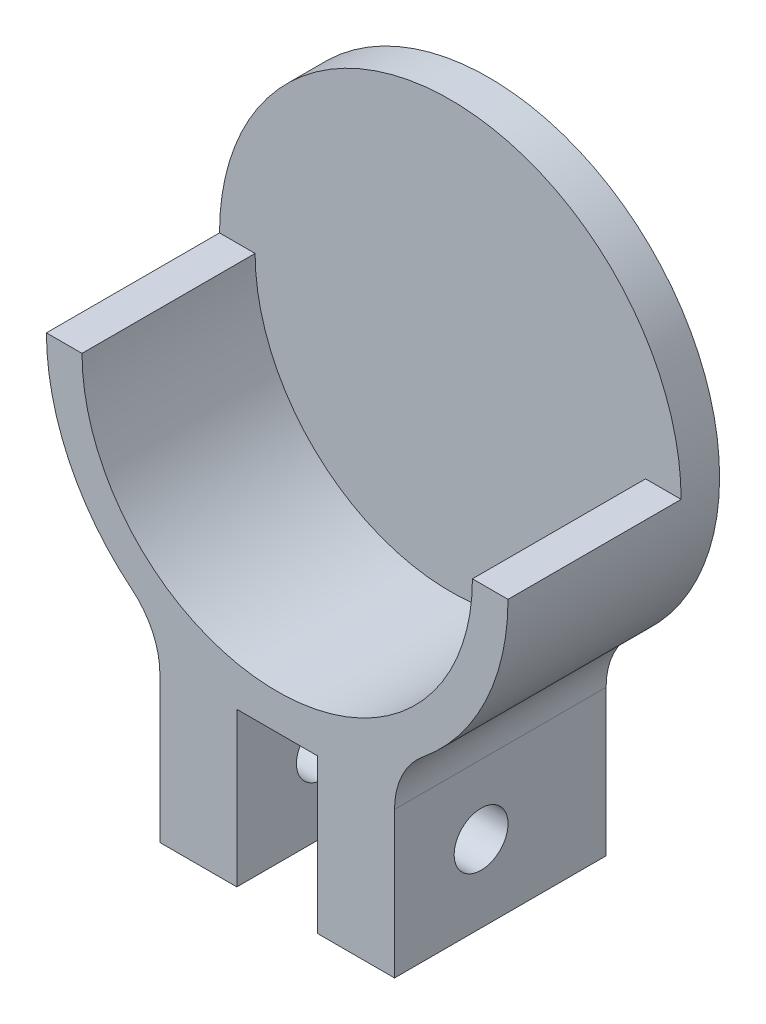
ISO-10303-21;
HEADER;
FILE_DESCRIPTION(('STEP AP214'),'2;1');
FILE_NAME('part.step','',(''),(''),'','','');
FILE_SCHEMA(('AUTOMOTIVE_DESIGN { 1 0 10303 214 1 1 1 1 }'));
ENDSEC;
DATA;
#1=APPLICATION_CONTEXT('core data for automotive mechanical design processes');
#2=APPLICATION_PROTOCOL_DEFINITION('international standard','automotive_design',2000,#1);
#3=PRODUCT_CONTEXT('',#1,'mechanical');
#4=PRODUCT('Part','Part','',(#3));
#5=PRODUCT_RELATED_PRODUCT_CATEGORY('part','',(#4));
#6=PRODUCT_DEFINITION_FORMATION('','',#4);
#7=PRODUCT_DEFINITION_CONTEXT('part definition',#1,'design');
#8=PRODUCT_DEFINITION('design','',#6,#7);
#9=PRODUCT_DEFINITION_SHAPE('','',#8);
#10=(LENGTH_UNIT() NAMED_UNIT(*) SI_UNIT(.MILLI.,.METRE.));
#11=(NAMED_UNIT(*) PLANE_ANGLE_UNIT() SI_UNIT($,.RADIAN.));
#12=(NAMED_UNIT(*) SI_UNIT($,.STERADIAN.) SOLID_ANGLE_UNIT());
#13=UNCERTAINTY_MEASURE_WITH_UNIT(LENGTH_MEASURE(1.E-05),#10,'distance_accuracy_value','');
#14=(GEOMETRIC_REPRESENTATION_CONTEXT(3) GLOBAL_UNCERTAINTY_ASSIGNED_CONTEXT((#13)) GLOBAL_UNIT_ASSIGNED_CONTEXT((#10,
#11,#12)) REPRESENTATION_CONTEXT('',''));
#15=CARTESIAN_POINT('',(0.,0.,0.));
#16=DIRECTION('',(0.,0.,1.));
#17=DIRECTION('',(1.,0.,0.));
#18=AXIS2_PLACEMENT_3D('',#15,#16,#17);
#19=CARTESIAN_POINT('',(-2.09999999991755,-12.,9.));
#20=DIRECTION('',(0.,1.,0.));
#21=DIRECTION('',(0.,0.,1.));
#22=AXIS2_PLACEMENT_3D('',#19,#20,#21);
#23=PLANE('',#22);
#24=DIRECTION('',(0.,0.,-1.));
#25=VECTOR('',#24,1.);
#26=CARTESIAN_POINT('',(-2.09999999991755,-12.,9.));
#27=LINE('',#26,#25);
#28=CARTESIAN_POINT('',(-2.09999999991755,-12.,9.));
#29=VERTEX_POINT('',#28);
#30=CARTESIAN_POINT('',(-2.09999999991755,-12.,-2.));
#31=VERTEX_POINT('',#30);
#32=EDGE_CURVE('E225',#29,#31,#27,.T.);
#33=ORIENTED_EDGE('',*,*,#32,.T.);
#34=DIRECTION('',(-1.,0.,0.));
#35=VECTOR('',#34,1.);
#36=CARTESIAN_POINT('',(0.,-12.,-2.));
#37=LINE('',#36,#35);
#38=CARTESIAN_POINT('',(2.09999999991755,-12.,-2.));
#39=VERTEX_POINT('',#38);
#40=EDGE_CURVE('E176',#39,#31,#37,.T.);
#41=ORIENTED_EDGE('',*,*,#40,.F.);
#42=DIRECTION('',(0.,0.,-1.));
#43=VECTOR('',#42,1.);
#44=CARTESIAN_POINT('',(2.09999999991755,-12.,9.));
#45=LINE('',#44,#43);
#46=CARTESIAN_POINT('',(2.09999999991755,-12.,9.));
#47=VERTEX_POINT('',#46);
#48=EDGE_CURVE('E149',#47,#39,#45,.T.);
#49=ORIENTED_EDGE('',*,*,#48,.F.);
#50=DIRECTION('',(1.,0.,0.));
#51=VECTOR('',#50,1.);
#52=CARTESIAN_POINT('',(-2.09999999991755,-12.,9.));
#53=LINE('',#52,#51);
#54=EDGE_CURVE('E199',#29,#47,#53,.T.);
#55=ORIENTED_EDGE('',*,*,#54,.F.);
#56=EDGE_LOOP('',(#33,#41,#49,#55));
#57=FACE_BOUND('',#56,.T.);
#58=ADVANCED_FACE('F39',(#57),#23,.F.);
#59=CARTESIAN_POINT('',(2.09999999991755,-20.,9.));
#60=DIRECTION('',(1.,0.,0.));
#61=DIRECTION('',(0.,0.,-1.));
#62=AXIS2_PLACEMENT_3D('',#59,#60,#61);
#63=PLANE('',#62);
#64=CARTESIAN_POINT('',(2.09999999991755,-15.9999999999286,4.5));
#65=DIRECTION('',(1.,0.,0.));
#66=DIRECTION('',(0.,0.,-1.));
#67=AXIS2_PLACEMENT_3D('',#64,#65,#66);
#68=CIRCLE('',#67,1.4);
#69=CARTESIAN_POINT('',(2.09999999991755,-15.9999999999286,3.1));
#70=VERTEX_POINT('',#69);
#71=EDGE_CURVE('E195',#70,#70,#68,.T.);
#72=ORIENTED_EDGE('',*,*,#71,.T.);
#73=EDGE_LOOP('',(#72));
#74=FACE_BOUND('',#73,.T.);
#75=ORIENTED_EDGE('',*,*,#48,.T.);
#76=DIRECTION('',(0.,1.,0.));
#77=VECTOR('',#76,1.);
#78=CARTESIAN_POINT('',(2.09999999991755,0.,-2.));
#79=LINE('',#78,#77);
#80=CARTESIAN_POINT('',(2.09999999991755,-20.,-2.));
#81=VERTEX_POINT('',#80);
#82=EDGE_CURVE('E173',#81,#39,#79,.T.);
#83=ORIENTED_EDGE('',*,*,#82,.F.);
#84=DIRECTION('',(0.,0.,-1.));
#85=VECTOR('',#84,1.);
#86=CARTESIAN_POINT('',(2.09999999991755,-20.,9.));
#87=LINE('',#86,#85);
#88=CARTESIAN_POINT('',(2.09999999991755,-20.,9.));
#89=VERTEX_POINT('',#88);
#90=EDGE_CURVE('E251',#89,#81,#87,.T.);
#91=ORIENTED_EDGE('',*,*,#90,.F.);
#92=DIRECTION('',(0.,-1.,0.));
#93=VECTOR('',#92,1.);
#94=CARTESIAN_POINT('',(2.09999999991755,-20.,9.));
#95=LINE('',#94,#93);
#96=EDGE_CURVE('E202',#47,#89,#95,.T.);
#97=ORIENTED_EDGE('',*,*,#96,.F.);
#98=EDGE_LOOP('',(#75,#83,#91,#97));
#99=FACE_BOUND('',#98,.T.);
#100=ADVANCED_FACE('F271',(#74,#99),#63,.F.);
#101=CARTESIAN_POINT('',(6.09999999991755,-20.,9.));
#102=DIRECTION('',(0.,1.,0.));
#103=DIRECTION('',(-1.,0.,0.));
#104=AXIS2_PLACEMENT_3D('',#101,#102,#103);
#105=PLANE('',#104);
#106=ORIENTED_EDGE('',*,*,#90,.T.);
#107=DIRECTION('',(-1.,0.,0.));
#108=VECTOR('',#107,1.);
#109=CARTESIAN_POINT('',(0.,-20.,-2.));
#110=LINE('',#109,#108);
#111=CARTESIAN_POINT('',(6.09999999991755,-20.,-2.));
#112=VERTEX_POINT('',#111);
#113=EDGE_CURVE('E170',#112,#81,#110,.T.);
#114=ORIENTED_EDGE('',*,*,#113,.F.);
#115=DIRECTION('',(0.,0.,-1.));
#116=VECTOR('',#115,1.);
#117=CARTESIAN_POINT('',(6.09999999991755,-20.,9.));
#118=LINE('',#117,#116);
#119=CARTESIAN_POINT('',(6.09999999991755,-20.,9.));
#120=VERTEX_POINT('',#119);
#121=EDGE_CURVE('E249',#120,#112,#118,.T.);
#122=ORIENTED_EDGE('',*,*,#121,.F.);
#123=DIRECTION('',(1.,0.,0.));
#124=VECTOR('',#123,1.);
#125=CARTESIAN_POINT('',(6.09999999991755,-20.,9.));
#126=LINE('',#125,#124);
#127=EDGE_CURVE('E205',#89,#120,#126,.T.);
#128=ORIENTED_EDGE('',*,*,#127,.F.);
#129=EDGE_LOOP('',(#106,#114,#122,#128));
#130=FACE_BOUND('',#129,.T.);
#131=ADVANCED_FACE('F268',(#130),#105,.F.);
#132=CARTESIAN_POINT('',(6.09999999991755,-20.,9.));
#133=DIRECTION('',(-1.,8.53742552152238E-12,0.));
#134=DIRECTION('',(-8.53742552152238E-12,-1.,0.));
#135=AXIS2_PLACEMENT_3D('',#132,#133,#134);
#136=PLANE('',#135);
#137=CARTESIAN_POINT('',(6.0999999999517,-15.9999999998937,4.5));
#138=DIRECTION('',(-1.,8.53742552152238E-12,0.));
#139=DIRECTION('',(-8.53742552152238E-12,-1.,0.));
#140=AXIS2_PLACEMENT_3D('',#137,#138,#139);
#141=CIRCLE('',#140,1.4);
#142=CARTESIAN_POINT('',(6.09999999993975,-17.3999999998937,4.5));
#143=VERTEX_POINT('',#142);
#144=EDGE_CURVE('E192',#143,#143,#141,.T.);
#145=ORIENTED_EDGE('',*,*,#144,.T.);
#146=EDGE_LOOP('',(#145));
#147=FACE_BOUND('',#146,.T.);
#148=ORIENTED_EDGE('',*,*,#121,.T.);
#149=DIRECTION('',(-8.53742552152238E-12,-1.,0.));
#150=VECTOR('',#149,1.);
#151=CARTESIAN_POINT('',(6.1000000000883,-5.20782956820403E-11,-2.));
#152=LINE('',#151,#150);
#153=CARTESIAN_POINT('',(6.09999999998235,-12.4092707279481,-2.));
#154=VERTEX_POINT('',#153);
#155=EDGE_CURVE('E157',#154,#112,#152,.T.);
#156=ORIENTED_EDGE('',*,*,#155,.F.);
#157=DIRECTION('',(0.,0.,1.));
#158=VECTOR('',#157,1.);
#159=CARTESIAN_POINT('',(6.09999999998235,-12.4092707279481,9.));
#160=LINE('',#159,#158);
#161=CARTESIAN_POINT('',(6.09999999998235,-12.4092707279481,9.));
#162=VERTEX_POINT('',#161);
#163=EDGE_CURVE('E148',#154,#162,#160,.T.);
#164=ORIENTED_EDGE('',*,*,#163,.T.);
#165=DIRECTION('',(8.53742552152238E-12,1.,0.));
#166=VECTOR('',#165,1.);
#167=CARTESIAN_POINT('',(6.09999999991755,-20.,9.));
#168=LINE('',#167,#166);
#169=EDGE_CURVE('E207',#120,#162,#168,.T.);
#170=ORIENTED_EDGE('',*,*,#169,.F.);
#171=EDGE_LOOP('',(#148,#156,#164,#170));
#172=FACE_BOUND('',#171,.T.);
#173=ADVANCED_FACE('F264',(#147,#172),#136,.F.);
#174=CARTESIAN_POINT('',(10.1500000000034,0.,9.));
#175=DIRECTION('',(0.,-1.,0.));
#176=DIRECTION('',(0.,0.,-1.));
#177=AXIS2_PLACEMENT_3D('',#174,#175,#176);
#178=PLANE('',#177);
#179=DIRECTION('',(-1.,0.,0.));
#180=VECTOR('',#179,1.);
#181=CARTESIAN_POINT('',(10.1500000000034,0.,0.));
#182=LINE('',#181,#180);
#183=CARTESIAN_POINT('',(12.,0.,0.));
#184=VERTEX_POINT('',#183);
#185=CARTESIAN_POINT('',(10.1500000000017,0.,0.));
#186=VERTEX_POINT('',#185);
#187=EDGE_CURVE('E198',#184,#186,#182,.T.);
#188=ORIENTED_EDGE('',*,*,#187,.T.);
#189=DIRECTION('',(0.,0.,-1.));
#190=VECTOR('',#189,1.);
#191=CARTESIAN_POINT('',(10.1500000000017,0.,9.));
#192=LINE('',#191,#190);
#193=CARTESIAN_POINT('',(10.1500000000017,0.,9.));
#194=VERTEX_POINT('',#193);
#195=EDGE_CURVE('E243',#194,#186,#192,.T.);
#196=ORIENTED_EDGE('',*,*,#195,.F.);
#197=DIRECTION('',(-1.,0.,0.));
#198=VECTOR('',#197,1.);
#199=CARTESIAN_POINT('',(10.1500000000034,0.,9.));
#200=LINE('',#199,#198);
#201=CARTESIAN_POINT('',(12.,0.,9.));
#202=VERTEX_POINT('',#201);
#203=EDGE_CURVE('E211',#202,#194,#200,.T.);
#204=ORIENTED_EDGE('',*,*,#203,.F.);
#205=DIRECTION('',(0.,0.,-1.));
#206=VECTOR('',#205,1.);
#207=CARTESIAN_POINT('',(12.,0.,9.));
#208=LINE('',#207,#206);
#209=EDGE_CURVE('E246',#202,#184,#208,.T.);
#210=ORIENTED_EDGE('',*,*,#209,.T.);
#211=EDGE_LOOP('',(#188,#196,#204,#210));
#212=FACE_BOUND('',#211,.T.);
#213=ADVANCED_FACE('F313',(#212),#178,.F.);
#214=CARTESIAN_POINT('',(0.,0.,9.));
#215=DIRECTION('',(0.,0.,-1.));
#216=DIRECTION('',(-1.,0.,0.));
#217=AXIS2_PLACEMENT_3D('',#214,#215,#216);
#218=CYLINDRICAL_SURFACE('',#217,10.1500000000017);
#219=CARTESIAN_POINT('',(0.,0.,0.));
#220=DIRECTION('',(0.,0.,-1.));
#221=DIRECTION('',(1.,0.,0.));
#222=AXIS2_PLACEMENT_3D('',#219,#220,#221);
#223=CIRCLE('',#222,10.1500000000017);
#224=CARTESIAN_POINT('',(-10.15,0.,0.));
#225=VERTEX_POINT('',#224);
#226=EDGE_CURVE('E228',#186,#225,#223,.T.);
#227=ORIENTED_EDGE('',*,*,#226,.T.);
#228=DIRECTION('',(0.,0.,-1.));
#229=VECTOR('',#228,1.);
#230=CARTESIAN_POINT('',(-10.15,0.,9.));
#231=LINE('',#230,#229);
#232=CARTESIAN_POINT('',(-10.15,0.,9.));
#233=VERTEX_POINT('',#232);
#234=EDGE_CURVE('E240',#233,#225,#231,.T.);
#235=ORIENTED_EDGE('',*,*,#234,.F.);
#236=CARTESIAN_POINT('',(0.,0.,9.));
#237=DIRECTION('',(0.,0.,-1.));
#238=DIRECTION('',(1.,0.,0.));
#239=AXIS2_PLACEMENT_3D('',#236,#237,#238);
#240=CIRCLE('',#239,10.1500000000017);
#241=EDGE_CURVE('E213',#194,#233,#240,.T.);
#242=ORIENTED_EDGE('',*,*,#241,.F.);
#243=ORIENTED_EDGE('',*,*,#195,.T.);
#244=EDGE_LOOP('',(#227,#235,#242,#243));
#245=FACE_BOUND('',#244,.T.);
#246=ADVANCED_FACE('F317',(#245),#218,.F.);
#247=CARTESIAN_POINT('',(-12.,0.,9.));
#248=DIRECTION('',(0.,-1.,0.));
#249=DIRECTION('',(0.,0.,-1.));
#250=AXIS2_PLACEMENT_3D('',#247,#248,#249);
#251=PLANE('',#250);
#252=DIRECTION('',(-1.,0.,0.));
#253=VECTOR('',#252,1.);
#254=CARTESIAN_POINT('',(-12.,0.,0.));
#255=LINE('',#254,#253);
#256=CARTESIAN_POINT('',(-12.,0.,0.));
#257=VERTEX_POINT('',#256);
#258=EDGE_CURVE('E203',#225,#257,#255,.T.);
#259=ORIENTED_EDGE('',*,*,#258,.T.);
#260=DIRECTION('',(0.,0.,-1.));
#261=VECTOR('',#260,1.);
#262=CARTESIAN_POINT('',(-12.,0.,9.));
#263=LINE('',#262,#261);
#264=CARTESIAN_POINT('',(-12.,0.,9.));
#265=VERTEX_POINT('',#264);
#266=EDGE_CURVE('E238',#265,#257,#263,.T.);
#267=ORIENTED_EDGE('',*,*,#266,.F.);
#268=DIRECTION('',(-1.,0.,0.));
#269=VECTOR('',#268,1.);
#270=CARTESIAN_POINT('',(-12.,0.,9.));
#271=LINE('',#270,#269);
#272=EDGE_CURVE('E215',#233,#265,#271,.T.);
#273=ORIENTED_EDGE('',*,*,#272,.F.);
#274=ORIENTED_EDGE('',*,*,#234,.T.);
#275=EDGE_LOOP('',(#259,#267,#273,#274));
#276=FACE_BOUND('',#275,.T.);
#277=ADVANCED_FACE('F321',(#276),#251,.F.);
#278=CARTESIAN_POINT('',(0.,0.,9.));
#279=DIRECTION('',(0.,0.,-1.));
#280=DIRECTION('',(-1.,0.,0.));
#281=AXIS2_PLACEMENT_3D('',#278,#279,#280);
#282=CYLINDRICAL_SURFACE('',#281,12.);
#283=ORIENTED_EDGE('',*,*,#266,.T.);
#284=CARTESIAN_POINT('',(0.,0.,0.));
#285=DIRECTION('',(0.,0.,-1.));
#286=DIRECTION('',(-1.,0.,0.));
#287=AXIS2_PLACEMENT_3D('',#284,#285,#286);
#288=CIRCLE('',#287,12.);
#289=EDGE_CURVE('E164',#257,#184,#288,.T.);
#290=ORIENTED_EDGE('',*,*,#289,.T.);
#291=ORIENTED_EDGE('',*,*,#209,.F.);
#292=CARTESIAN_POINT('',(0.,0.,9.));
#293=DIRECTION('',(0.,0.,1.));
#294=DIRECTION('',(1.,0.,0.));
#295=AXIS2_PLACEMENT_3D('',#292,#293,#294);
#296=CIRCLE('',#295,12.);
#297=CARTESIAN_POINT('',(7.57499999998677,-9.30695304598669,9.));
#298=VERTEX_POINT('',#297);
#299=EDGE_CURVE('E145',#298,#202,#296,.T.);
#300=ORIENTED_EDGE('',*,*,#299,.F.);
#301=DIRECTION('',(0.,0.,-1.));
#302=VECTOR('',#301,1.);
#303=CARTESIAN_POINT('',(7.57499999998677,-9.30695304598669,9.));
#304=LINE('',#303,#302);
#305=CARTESIAN_POINT('',(7.57499999998677,-9.30695304598669,-2.));
#306=VERTEX_POINT('',#305);
#307=EDGE_CURVE('E138',#298,#306,#304,.T.);
#308=ORIENTED_EDGE('',*,*,#307,.T.);
#309=CARTESIAN_POINT('',(0.,0.,-2.));
#310=DIRECTION('',(0.,0.,-1.));
#311=DIRECTION('',(-1.,0.,0.));
#312=AXIS2_PLACEMENT_3D('',#309,#310,#311);
#313=CIRCLE('',#312,12.);
#314=CARTESIAN_POINT('',(-7.57499999998673,-9.3069530459867,-2.));
#315=VERTEX_POINT('',#314);
#316=EDGE_CURVE('E143',#315,#306,#313,.T.);
#317=ORIENTED_EDGE('',*,*,#316,.F.);
#318=DIRECTION('',(0.,0.,-1.));
#319=VECTOR('',#318,1.);
#320=CARTESIAN_POINT('',(-7.57499999998672,-9.30695304598671,9.));
#321=LINE('',#320,#319);
#322=CARTESIAN_POINT('',(-7.57499999998673,-9.30695304598671,9.));
#323=VERTEX_POINT('',#322);
#324=EDGE_CURVE('E54',#315,#323,#321,.F.);
#325=ORIENTED_EDGE('',*,*,#324,.T.);
#326=CARTESIAN_POINT('',(0.,0.,9.));
#327=DIRECTION('',(0.,0.,1.));
#328=DIRECTION('',(1.,0.,0.));
#329=AXIS2_PLACEMENT_3D('',#326,#327,#328);
#330=CIRCLE('',#329,12.);
#331=EDGE_CURVE('E217',#265,#323,#330,.T.);
#332=ORIENTED_EDGE('',*,*,#331,.F.);
#333=EDGE_LOOP('',(#283,#290,#291,#300,#308,#317,#325,#332));
#334=FACE_BOUND('',#333,.T.);
#335=ADVANCED_FACE('F141',(#334),#282,.T.);
#336=CARTESIAN_POINT('',(-6.09999999991755,-20.,9.));
#337=DIRECTION('',(1.,8.53006745111504E-12,0.));
#338=DIRECTION('',(-8.53006745111504E-12,1.,0.));
#339=AXIS2_PLACEMENT_3D('',#336,#337,#338);
#340=PLANE('',#339);
#341=CARTESIAN_POINT('',(-6.09999999994878,-16.,4.5));
#342=DIRECTION('',(-1.,-8.71029140230134E-12,0.));
#343=DIRECTION('',(8.71029140230134E-12,-1.,0.));
#344=AXIS2_PLACEMENT_3D('',#341,#342,#343);
#345=CIRCLE('',#344,1.4);
#346=CARTESIAN_POINT('',(-6.09999999993659,-17.4,4.5));
#347=VERTEX_POINT('',#346);
#348=EDGE_CURVE('E187',#347,#347,#345,.T.);
#349=ORIENTED_EDGE('',*,*,#348,.F.);
#350=EDGE_LOOP('',(#349));
#351=FACE_BOUND('',#350,.T.);
#352=DIRECTION('',(8.53006745111504E-12,-1.,0.));
#353=VECTOR('',#352,1.);
#354=CARTESIAN_POINT('',(-6.09999999991755,-20.,9.));
#355=LINE('',#354,#353);
#356=CARTESIAN_POINT('',(-6.0999999999823,-12.4092707279482,9.));
#357=VERTEX_POINT('',#356);
#358=CARTESIAN_POINT('',(-6.09999999991755,-20.,9.));
#359=VERTEX_POINT('',#358);
#360=EDGE_CURVE('E219',#357,#359,#355,.T.);
#361=ORIENTED_EDGE('',*,*,#360,.F.);
#362=DIRECTION('',(0.,0.,1.));
#363=VECTOR('',#362,1.);
#364=CARTESIAN_POINT('',(-6.0999999999823,-12.4092707279482,0.));
#365=LINE('',#364,#363);
#366=CARTESIAN_POINT('',(-6.0999999999823,-12.4092707279482,-2.));
#367=VERTEX_POINT('',#366);
#368=EDGE_CURVE('E257',#357,#367,#365,.F.);
#369=ORIENTED_EDGE('',*,*,#368,.T.);
#370=DIRECTION('',(-8.53006745111504E-12,1.,0.));
#371=VECTOR('',#370,1.);
#372=CARTESIAN_POINT('',(-6.10000000008815,-5.20334114525537E-11,-2.));
#373=LINE('',#372,#371);
#374=CARTESIAN_POINT('',(-6.09999999991755,-20.,-2.));
#375=VERTEX_POINT('',#374);
#376=EDGE_CURVE('E185',#375,#367,#373,.T.);
#377=ORIENTED_EDGE('',*,*,#376,.F.);
#378=DIRECTION('',(0.,0.,-1.));
#379=VECTOR('',#378,1.);
#380=CARTESIAN_POINT('',(-6.09999999991755,-20.,9.));
#381=LINE('',#380,#379);
#382=EDGE_CURVE('E236',#359,#375,#381,.T.);
#383=ORIENTED_EDGE('',*,*,#382,.F.);
#384=EDGE_LOOP('',(#361,#369,#377,#383));
#385=FACE_BOUND('',#384,.T.);
#386=ADVANCED_FACE('F289',(#351,#385),#340,.F.);
#387=CARTESIAN_POINT('',(-6.09999999991755,-20.,9.));
#388=DIRECTION('',(0.,1.,0.));
#389=DIRECTION('',(-1.,0.,0.));
#390=AXIS2_PLACEMENT_3D('',#387,#388,#389);
#391=PLANE('',#390);
#392=ORIENTED_EDGE('',*,*,#382,.T.);
#393=DIRECTION('',(-1.,0.,0.));
#394=VECTOR('',#393,1.);
#395=CARTESIAN_POINT('',(0.,-20.,-2.));
#396=LINE('',#395,#394);
#397=CARTESIAN_POINT('',(-2.09999999991755,-20.,-2.));
#398=VERTEX_POINT('',#397);
#399=EDGE_CURVE('E182',#398,#375,#396,.T.);
#400=ORIENTED_EDGE('',*,*,#399,.F.);
#401=DIRECTION('',(0.,0.,-1.));
#402=VECTOR('',#401,1.);
#403=CARTESIAN_POINT('',(-2.09999999991755,-20.,9.));
#404=LINE('',#403,#402);
#405=CARTESIAN_POINT('',(-2.09999999991755,-20.,9.));
#406=VERTEX_POINT('',#405);
#407=EDGE_CURVE('E234',#406,#398,#404,.T.);
#408=ORIENTED_EDGE('',*,*,#407,.F.);
#409=DIRECTION('',(1.,0.,0.));
#410=VECTOR('',#409,1.);
#411=CARTESIAN_POINT('',(-6.09999999991755,-20.,9.));
#412=LINE('',#411,#410);
#413=EDGE_CURVE('E221',#359,#406,#412,.T.);
#414=ORIENTED_EDGE('',*,*,#413,.F.);
#415=EDGE_LOOP('',(#392,#400,#408,#414));
#416=FACE_BOUND('',#415,.T.);
#417=ADVANCED_FACE('F285',(#416),#391,.F.);
#418=CARTESIAN_POINT('',(-2.09999999991755,-20.,9.));
#419=DIRECTION('',(-1.,0.,0.));
#420=DIRECTION('',(0.,0.,1.));
#421=AXIS2_PLACEMENT_3D('',#418,#419,#420);
#422=PLANE('',#421);
#423=CARTESIAN_POINT('',(-2.09999999991755,-15.9999999999652,4.5));
#424=DIRECTION('',(-1.,0.,0.));
#425=DIRECTION('',(0.,0.,1.));
#426=AXIS2_PLACEMENT_3D('',#423,#424,#425);
#427=CIRCLE('',#426,1.4);
#428=CARTESIAN_POINT('',(-2.09999999991755,-15.9999999999652,5.9));
#429=VERTEX_POINT('',#428);
#430=EDGE_CURVE('E191',#429,#429,#427,.T.);
#431=ORIENTED_EDGE('',*,*,#430,.T.);
#432=EDGE_LOOP('',(#431));
#433=FACE_BOUND('',#432,.T.);
#434=ORIENTED_EDGE('',*,*,#407,.T.);
#435=DIRECTION('',(0.,-1.,0.));
#436=VECTOR('',#435,1.);
#437=CARTESIAN_POINT('',(-2.09999999991755,0.,-2.));
#438=LINE('',#437,#436);
#439=EDGE_CURVE('E179',#31,#398,#438,.T.);
#440=ORIENTED_EDGE('',*,*,#439,.F.);
#441=ORIENTED_EDGE('',*,*,#32,.F.);
#442=DIRECTION('',(0.,1.,0.));
#443=VECTOR('',#442,1.);
#444=CARTESIAN_POINT('',(-2.09999999991755,-20.,9.));
#445=LINE('',#444,#443);
#446=EDGE_CURVE('E223',#406,#29,#445,.T.);
#447=ORIENTED_EDGE('',*,*,#446,.F.);
#448=EDGE_LOOP('',(#434,#440,#441,#447));
#449=FACE_BOUND('',#448,.T.);
#450=ADVANCED_FACE('F280',(#433,#449),#422,.F.);
#451=CARTESIAN_POINT('',(0.,0.,9.));
#452=DIRECTION('',(0.,0.,1.));
#453=DIRECTION('',(1.,0.,0.));
#454=AXIS2_PLACEMENT_3D('',#451,#452,#453);
#455=PLANE('',#454);
#456=ORIENTED_EDGE('',*,*,#54,.T.);
#457=ORIENTED_EDGE('',*,*,#96,.T.);
#458=ORIENTED_EDGE('',*,*,#127,.T.);
#459=ORIENTED_EDGE('',*,*,#169,.T.);
#460=CARTESIAN_POINT('',(10.0999999999824,-12.4092707279823,9.));
#461=DIRECTION('',(0.,0.,1.));
#462=DIRECTION('',(1.,0.,0.));
#463=AXIS2_PLACEMENT_3D('',#460,#461,#462);
#464=CIRCLE('',#463,4.);
#465=EDGE_CURVE('E47',#162,#298,#464,.F.);
#466=ORIENTED_EDGE('',*,*,#465,.T.);
#467=ORIENTED_EDGE('',*,*,#299,.T.);
#468=ORIENTED_EDGE('',*,*,#203,.T.);
#469=ORIENTED_EDGE('',*,*,#241,.T.);
#470=ORIENTED_EDGE('',*,*,#272,.T.);
#471=ORIENTED_EDGE('',*,*,#331,.T.);
#472=CARTESIAN_POINT('',(-10.0999999999823,-12.4092707279823,9.));
#473=DIRECTION('',(0.,0.,1.));
#474=DIRECTION('',(1.,0.,0.));
#475=AXIS2_PLACEMENT_3D('',#472,#473,#474);
#476=CIRCLE('',#475,4.);
#477=EDGE_CURVE('E11',#323,#357,#476,.F.);
#478=ORIENTED_EDGE('',*,*,#477,.T.);
#479=ORIENTED_EDGE('',*,*,#360,.T.);
#480=ORIENTED_EDGE('',*,*,#413,.T.);
#481=ORIENTED_EDGE('',*,*,#446,.T.);
#482=EDGE_LOOP('',(#456,#457,#458,#459,#466,#467,#468,#469,#470,#471,#478,#479,#480,#481));
#483=FACE_BOUND('',#482,.T.);
#484=ADVANCED_FACE('F259',(#483),#455,.T.);
#485=CARTESIAN_POINT('',(12.0000000001394,-15.9999999998423,4.5));
#486=DIRECTION('',(-1.,-8.71029140230134E-12,0.));
#487=DIRECTION('',(8.71029140230134E-12,-1.,0.));
#488=AXIS2_PLACEMENT_3D('',#485,#486,#487);
#489=CYLINDRICAL_SURFACE('',#488,1.4);
#490=ORIENTED_EDGE('',*,*,#348,.T.);
#491=EDGE_LOOP('',(#490));
#492=FACE_BOUND('',#491,.T.);
#493=ORIENTED_EDGE('',*,*,#430,.F.);
#494=EDGE_LOOP('',(#493));
#495=FACE_BOUND('',#494,.T.);
#496=ADVANCED_FACE('F338',(#492,#495),#489,.F.);
#497=ORIENTED_EDGE('',*,*,#144,.F.);
#498=EDGE_LOOP('',(#497));
#499=FACE_BOUND('',#498,.T.);
#500=ORIENTED_EDGE('',*,*,#71,.F.);
#501=EDGE_LOOP('',(#500));
#502=FACE_BOUND('',#501,.T.);
#503=ADVANCED_FACE('F299',(#499,#502),#489,.F.);
#504=CARTESIAN_POINT('',(10.0999999999824,-12.4092707279823,9.));
#505=DIRECTION('',(0.,0.,-1.));
#506=DIRECTION('',(-1.,0.,0.));
#507=AXIS2_PLACEMENT_3D('',#504,#505,#506);
#508=CYLINDRICAL_SURFACE('',#507,4.);
#509=ORIENTED_EDGE('',*,*,#465,.F.);
#510=ORIENTED_EDGE('',*,*,#163,.F.);
#511=CARTESIAN_POINT('',(10.0999999999824,-12.4092707279823,-2.));
#512=DIRECTION('',(0.,0.,-1.));
#513=DIRECTION('',(-1.,0.,0.));
#514=AXIS2_PLACEMENT_3D('',#511,#512,#513);
#515=CIRCLE('',#514,4.);
#516=EDGE_CURVE('E152',#306,#154,#515,.F.);
#517=ORIENTED_EDGE('',*,*,#516,.F.);
#518=ORIENTED_EDGE('',*,*,#307,.F.);
#519=EDGE_LOOP('',(#509,#510,#517,#518));
#520=FACE_BOUND('',#519,.T.);
#521=ADVANCED_FACE('F153',(#520),#508,.F.);
#522=CARTESIAN_POINT('',(-10.0999999999823,-12.4092707279823,9.));
#523=DIRECTION('',(0.,0.,-1.));
#524=DIRECTION('',(-1.,0.,0.));
#525=AXIS2_PLACEMENT_3D('',#522,#523,#524);
#526=CYLINDRICAL_SURFACE('',#525,4.);
#527=ORIENTED_EDGE('',*,*,#477,.F.);
#528=ORIENTED_EDGE('',*,*,#324,.F.);
#529=CARTESIAN_POINT('',(-10.0999999999823,-12.4092707279823,-2.));
#530=DIRECTION('',(0.,0.,-1.));
#531=DIRECTION('',(-1.,0.,0.));
#532=AXIS2_PLACEMENT_3D('',#529,#530,#531);
#533=CIRCLE('',#532,4.);
#534=EDGE_CURVE('E163',#367,#315,#533,.F.);
#535=ORIENTED_EDGE('',*,*,#534,.F.);
#536=ORIENTED_EDGE('',*,*,#368,.F.);
#537=EDGE_LOOP('',(#527,#528,#535,#536));
#538=FACE_BOUND('',#537,.T.);
#539=ADVANCED_FACE('F41',(#538),#526,.F.);
#540=CARTESIAN_POINT('',(0.,0.,-2.));
#541=DIRECTION('',(0.,0.,-1.));
#542=DIRECTION('',(-1.,0.,0.));
#543=AXIS2_PLACEMENT_3D('',#540,#541,#542);
#544=PLANE('',#543);
#545=ORIENTED_EDGE('',*,*,#316,.T.);
#546=ORIENTED_EDGE('',*,*,#516,.T.);
#547=ORIENTED_EDGE('',*,*,#155,.T.);
#548=ORIENTED_EDGE('',*,*,#113,.T.);
#549=ORIENTED_EDGE('',*,*,#82,.T.);
#550=ORIENTED_EDGE('',*,*,#40,.T.);
#551=ORIENTED_EDGE('',*,*,#439,.T.);
#552=ORIENTED_EDGE('',*,*,#399,.T.);
#553=ORIENTED_EDGE('',*,*,#376,.T.);
#554=ORIENTED_EDGE('',*,*,#534,.T.);
#555=EDGE_LOOP('',(#545,#546,#547,#548,#549,#550,#551,#552,#553,#554));
#556=FACE_BOUND('',#555,.T.);
#557=ADVANCED_FACE('F160',(#556),#544,.T.);
#558=CARTESIAN_POINT('',(0.,0.,0.));
#559=DIRECTION('',(0.,0.,-1.));
#560=DIRECTION('',(-1.,0.,0.));
#561=AXIS2_PLACEMENT_3D('',#558,#559,#560);
#562=PLANE('',#561);
#563=ORIENTED_EDGE('',*,*,#258,.F.);
#564=ORIENTED_EDGE('',*,*,#226,.F.);
#565=ORIENTED_EDGE('',*,*,#187,.F.);
#566=ORIENTED_EDGE('',*,*,#289,.F.);
#567=EDGE_LOOP('',(#563,#564,#565,#566));
#568=FACE_BOUND('',#567,.T.);
#569=ADVANCED_FACE('F297',(#568),#562,.F.);
#570=CLOSED_SHELL('',(#58,#100,#131,#173,#213,#246,#277,#335,#386,#417,#450,#484,#496,#503,#521,
#539,#557,#569));
#571=MANIFOLD_SOLID_BREP('B2',#570);
#572=ADVANCED_BREP_SHAPE_REPRESENTATION('',(#18,#571),#14);
#573=SHAPE_DEFINITION_REPRESENTATION(#9,#572);
ENDSEC;
END-ISO-10303-21;
